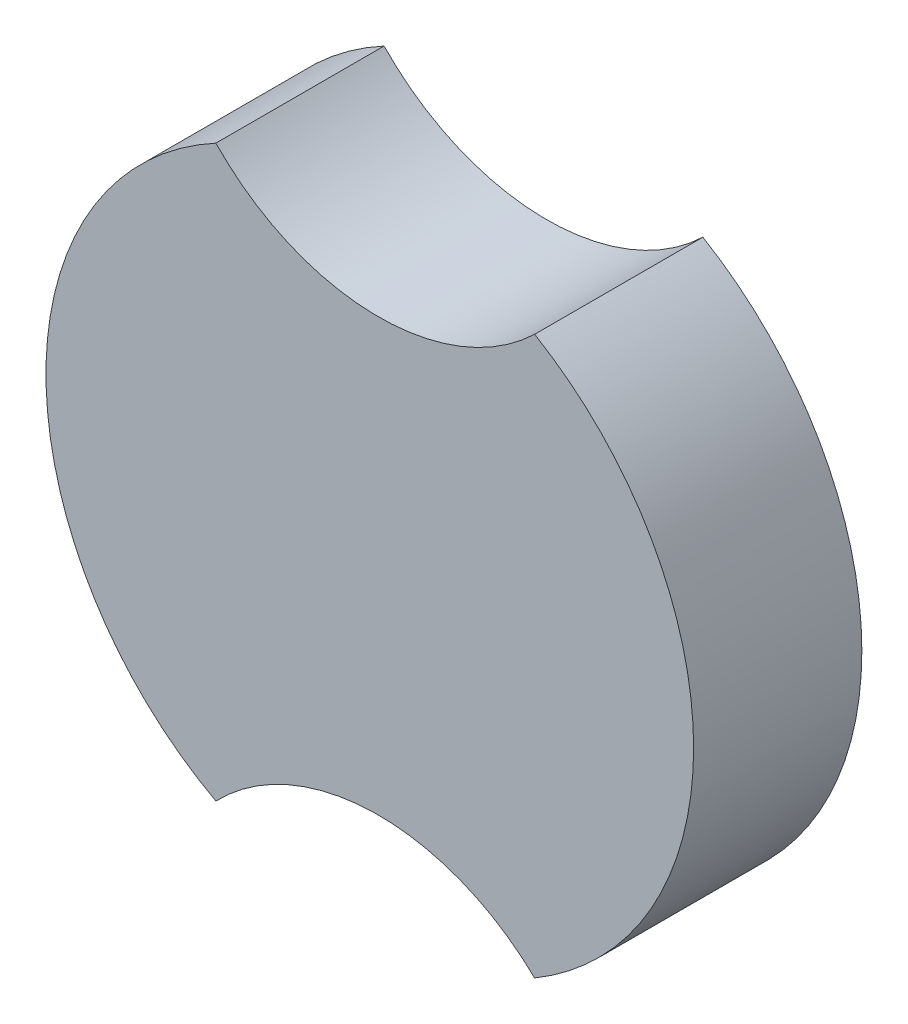
ISO-10303-21;
HEADER;
FILE_DESCRIPTION(('STEP AP214'),'2;1');
FILE_NAME('part.step','',(''),(''),'','','');
FILE_SCHEMA(('AUTOMOTIVE_DESIGN { 1 0 10303 214 1 1 1 1 }'));
ENDSEC;
DATA;
#1=APPLICATION_CONTEXT('core data for automotive mechanical design processes');
#2=APPLICATION_PROTOCOL_DEFINITION('international standard','automotive_design',2000,#1);
#3=PRODUCT_CONTEXT('',#1,'mechanical');
#4=PRODUCT('Part','Part','',(#3));
#5=PRODUCT_RELATED_PRODUCT_CATEGORY('part','',(#4));
#6=PRODUCT_DEFINITION_FORMATION('','',#4);
#7=PRODUCT_DEFINITION_CONTEXT('part definition',#1,'design');
#8=PRODUCT_DEFINITION('design','',#6,#7);
#9=PRODUCT_DEFINITION_SHAPE('','',#8);
#10=(LENGTH_UNIT() NAMED_UNIT(*) SI_UNIT(.MILLI.,.METRE.));
#11=(NAMED_UNIT(*) PLANE_ANGLE_UNIT() SI_UNIT($,.RADIAN.));
#12=(NAMED_UNIT(*) SI_UNIT($,.STERADIAN.) SOLID_ANGLE_UNIT());
#13=UNCERTAINTY_MEASURE_WITH_UNIT(LENGTH_MEASURE(1.E-05),#10,'distance_accuracy_value','');
#14=(GEOMETRIC_REPRESENTATION_CONTEXT(3) GLOBAL_UNCERTAINTY_ASSIGNED_CONTEXT((#13)) GLOBAL_UNIT_ASSIGNED_CONTEXT((#10,
#11,#12)) REPRESENTATION_CONTEXT('',''));
#15=CARTESIAN_POINT('',(0.,0.,0.));
#16=DIRECTION('',(0.,0.,1.));
#17=DIRECTION('',(1.,0.,0.));
#18=AXIS2_PLACEMENT_3D('',#15,#16,#17);
#19=CARTESIAN_POINT('',(0.,0.,20.));
#20=DIRECTION('',(0.,0.,-1.));
#21=DIRECTION('',(-1.,0.,0.));
#22=AXIS2_PLACEMENT_3D('',#19,#20,#21);
#23=CYLINDRICAL_SURFACE('',#22,38.5);
#24=DIRECTION('',(0.,0.,-1.));
#25=VECTOR('',#24,1.);
#26=CARTESIAN_POINT('',(19.5976542419797,33.1388284073504,20.));
#27=LINE('',#26,#25);
#28=CARTESIAN_POINT('',(19.5976542419797,33.1388284073504,20.));
#29=VERTEX_POINT('',#28);
#30=CARTESIAN_POINT('',(19.5976542419797,33.1388284073504,0.));
#31=VERTEX_POINT('',#30);
#32=EDGE_CURVE('E63',#29,#31,#27,.T.);
#33=ORIENTED_EDGE('',*,*,#32,.F.);
#34=CARTESIAN_POINT('',(0.,0.,20.));
#35=DIRECTION('',(0.,0.,1.));
#36=DIRECTION('',(1.,0.,0.));
#37=AXIS2_PLACEMENT_3D('',#34,#35,#36);
#38=CIRCLE('',#37,38.5);
#39=CARTESIAN_POINT('',(19.5976542419797,-33.1388284073504,20.));
#40=VERTEX_POINT('',#39);
#41=EDGE_CURVE('E48',#40,#29,#38,.T.);
#42=ORIENTED_EDGE('',*,*,#41,.F.);
#43=DIRECTION('',(0.,0.,-1.));
#44=VECTOR('',#43,1.);
#45=CARTESIAN_POINT('',(19.5976542419797,-33.1388284073504,20.));
#46=LINE('',#45,#44);
#47=CARTESIAN_POINT('',(19.5976542419797,-33.1388284073504,0.));
#48=VERTEX_POINT('',#47);
#49=EDGE_CURVE('E100',#40,#48,#46,.T.);
#50=ORIENTED_EDGE('',*,*,#49,.T.);
#51=CARTESIAN_POINT('',(0.,0.,0.));
#52=DIRECTION('',(0.,0.,1.));
#53=DIRECTION('',(1.,0.,0.));
#54=AXIS2_PLACEMENT_3D('',#51,#52,#53);
#55=CIRCLE('',#54,38.5);
#56=EDGE_CURVE('E42',#48,#31,#55,.T.);
#57=ORIENTED_EDGE('',*,*,#56,.T.);
#58=EDGE_LOOP('',(#33,#42,#50,#57));
#59=FACE_BOUND('',#58,.T.);
#60=ADVANCED_FACE('F39',(#59),#23,.T.);
#61=DIRECTION('',(0.,0.,-1.));
#62=VECTOR('',#61,1.);
#63=CARTESIAN_POINT('',(-18.3013469018546,33.8719751649941,20.));
#64=LINE('',#63,#62);
#65=CARTESIAN_POINT('',(-18.3013469018546,33.8719751649941,20.));
#66=VERTEX_POINT('',#65);
#67=CARTESIAN_POINT('',(-18.3013469018546,33.8719751649941,0.));
#68=VERTEX_POINT('',#67);
#69=EDGE_CURVE('E79',#66,#68,#64,.T.);
#70=ORIENTED_EDGE('',*,*,#69,.T.);
#71=CARTESIAN_POINT('',(-18.3013469018546,-33.8719751649941,0.));
#72=VERTEX_POINT('',#71);
#73=EDGE_CURVE('E98',#68,#72,#55,.T.);
#74=ORIENTED_EDGE('',*,*,#73,.T.);
#75=DIRECTION('',(0.,0.,-1.));
#76=VECTOR('',#75,1.);
#77=CARTESIAN_POINT('',(-18.3013469018546,-33.8719751649941,20.));
#78=LINE('',#77,#76);
#79=CARTESIAN_POINT('',(-18.3013469018546,-33.8719751649941,20.));
#80=VERTEX_POINT('',#79);
#81=EDGE_CURVE('E55',#80,#72,#78,.T.);
#82=ORIENTED_EDGE('',*,*,#81,.F.);
#83=EDGE_CURVE('E11',#66,#80,#38,.T.);
#84=ORIENTED_EDGE('',*,*,#83,.F.);
#85=EDGE_LOOP('',(#70,#74,#82,#84));
#86=FACE_BOUND('',#85,.T.);
#87=ADVANCED_FACE('F97',(#86),#23,.T.);
#88=CARTESIAN_POINT('',(0.,0.,20.));
#89=DIRECTION('',(0.,0.,1.));
#90=DIRECTION('',(1.,0.,0.));
#91=AXIS2_PLACEMENT_3D('',#88,#89,#90);
#92=PLANE('',#91);
#93=ORIENTED_EDGE('',*,*,#41,.T.);
#94=CARTESIAN_POINT('',(1.01472704888445,52.4549023580894,20.));
#95=DIRECTION('',(0.,0.,1.));
#96=DIRECTION('',(1.,0.,0.));
#97=AXIS2_PLACEMENT_3D('',#94,#95,#96);
#98=CIRCLE('',#97,26.8036545257228);
#99=EDGE_CURVE('E82',#66,#29,#98,.T.);
#100=ORIENTED_EDGE('',*,*,#99,.F.);
#101=ORIENTED_EDGE('',*,*,#83,.T.);
#102=CARTESIAN_POINT('',(1.01472704888445,-52.4549023580894,20.));
#103=DIRECTION('',(0.,0.,1.));
#104=DIRECTION('',(-1.,0.,0.));
#105=AXIS2_PLACEMENT_3D('',#102,#103,#104);
#106=CIRCLE('',#105,26.8036545257228);
#107=EDGE_CURVE('E101',#40,#80,#106,.T.);
#108=ORIENTED_EDGE('',*,*,#107,.F.);
#109=EDGE_LOOP('',(#93,#100,#101,#108));
#110=FACE_BOUND('',#109,.T.);
#111=ADVANCED_FACE('F92',(#110),#92,.T.);
#112=CARTESIAN_POINT('',(0.,0.,0.));
#113=DIRECTION('',(0.,0.,1.));
#114=DIRECTION('',(1.,0.,0.));
#115=AXIS2_PLACEMENT_3D('',#112,#113,#114);
#116=PLANE('',#115);
#117=CARTESIAN_POINT('',(0.,0.,0.));
#118=DIRECTION('',(0.,0.,1.));
#119=DIRECTION('',(1.,0.,0.));
#120=AXIS2_PLACEMENT_3D('',#117,#118,#119);
#121=CIRCLE('',#120,2.5);
#122=CARTESIAN_POINT('',(2.5,0.,0.));
#123=VERTEX_POINT('',#122);
#124=EDGE_CURVE('E123',#123,#123,#121,.T.);
#125=ORIENTED_EDGE('',*,*,#124,.T.);
#126=EDGE_LOOP('',(#125));
#127=FACE_BOUND('',#126,.T.);
#128=CARTESIAN_POINT('',(1.01472704888445,52.4549023580894,0.));
#129=DIRECTION('',(0.,0.,1.));
#130=DIRECTION('',(1.,0.,0.));
#131=AXIS2_PLACEMENT_3D('',#128,#129,#130);
#132=CIRCLE('',#131,26.8036545257228);
#133=EDGE_CURVE('E83',#68,#31,#132,.T.);
#134=ORIENTED_EDGE('',*,*,#133,.T.);
#135=ORIENTED_EDGE('',*,*,#56,.F.);
#136=CARTESIAN_POINT('',(1.01472704888445,-52.4549023580894,0.));
#137=DIRECTION('',(0.,0.,1.));
#138=DIRECTION('',(-1.,0.,0.));
#139=AXIS2_PLACEMENT_3D('',#136,#137,#138);
#140=CIRCLE('',#139,26.8036545257228);
#141=EDGE_CURVE('E107',#48,#72,#140,.T.);
#142=ORIENTED_EDGE('',*,*,#141,.T.);
#143=ORIENTED_EDGE('',*,*,#73,.F.);
#144=EDGE_LOOP('',(#134,#135,#142,#143));
#145=FACE_BOUND('',#144,.T.);
#146=ADVANCED_FACE('F117',(#127,#145),#116,.F.);
#147=CARTESIAN_POINT('',(1.01472704888445,-52.4549023580894,20.));
#148=DIRECTION('',(0.,0.,-1.));
#149=DIRECTION('',(-1.,0.,0.));
#150=AXIS2_PLACEMENT_3D('',#147,#148,#149);
#151=CYLINDRICAL_SURFACE('',#150,26.8036545257228);
#152=ORIENTED_EDGE('',*,*,#141,.F.);
#153=ORIENTED_EDGE('',*,*,#49,.F.);
#154=ORIENTED_EDGE('',*,*,#107,.T.);
#155=ORIENTED_EDGE('',*,*,#81,.T.);
#156=EDGE_LOOP('',(#152,#153,#154,#155));
#157=FACE_BOUND('',#156,.T.);
#158=ADVANCED_FACE('F154',(#157),#151,.F.);
#159=CARTESIAN_POINT('',(1.01472704888445,52.4549023580894,20.));
#160=DIRECTION('',(0.,0.,-1.));
#161=DIRECTION('',(-1.,0.,0.));
#162=AXIS2_PLACEMENT_3D('',#159,#160,#161);
#163=CYLINDRICAL_SURFACE('',#162,26.8036545257228);
#164=ORIENTED_EDGE('',*,*,#133,.F.);
#165=ORIENTED_EDGE('',*,*,#69,.F.);
#166=ORIENTED_EDGE('',*,*,#99,.T.);
#167=ORIENTED_EDGE('',*,*,#32,.T.);
#168=EDGE_LOOP('',(#164,#165,#166,#167));
#169=FACE_BOUND('',#168,.T.);
#170=ADVANCED_FACE('F81',(#169),#163,.F.);
#171=CARTESIAN_POINT('',(0.,0.,8.));
#172=DIRECTION('',(0.,0.,-1.));
#173=DIRECTION('',(-1.,0.,0.));
#174=AXIS2_PLACEMENT_3D('',#171,#172,#173);
#175=CYLINDRICAL_SURFACE('',#174,2.5);
#176=CARTESIAN_POINT('',(0.,0.,8.));
#177=DIRECTION('',(0.,0.,1.));
#178=DIRECTION('',(1.,0.,0.));
#179=AXIS2_PLACEMENT_3D('',#176,#177,#178);
#180=CIRCLE('',#179,2.5);
#181=CARTESIAN_POINT('',(2.5,0.,8.));
#182=VERTEX_POINT('',#181);
#183=EDGE_CURVE('E127',#182,#182,#180,.T.);
#184=ORIENTED_EDGE('',*,*,#183,.T.);
#185=EDGE_LOOP('',(#184));
#186=FACE_BOUND('',#185,.T.);
#187=ORIENTED_EDGE('',*,*,#124,.F.);
#188=EDGE_LOOP('',(#187));
#189=FACE_BOUND('',#188,.T.);
#190=ADVANCED_FACE('F133',(#186,#189),#175,.F.);
#191=CARTESIAN_POINT('',(0.,0.,8.));
#192=DIRECTION('',(0.,0.,1.));
#193=DIRECTION('',(1.,0.,0.));
#194=AXIS2_PLACEMENT_3D('',#191,#192,#193);
#195=PLANE('',#194);
#196=ORIENTED_EDGE('',*,*,#183,.F.);
#197=EDGE_LOOP('',(#196));
#198=FACE_BOUND('',#197,.T.);
#199=ADVANCED_FACE('F136',(#198),#195,.F.);
#200=CLOSED_SHELL('',(#60,#87,#111,#146,#158,#170,#190,#199));
#201=MANIFOLD_SOLID_BREP('B2',#200);
#202=ADVANCED_BREP_SHAPE_REPRESENTATION('',(#18,#201),#14);
#203=SHAPE_DEFINITION_REPRESENTATION(#9,#202);
ENDSEC;
END-ISO-10303-21;
